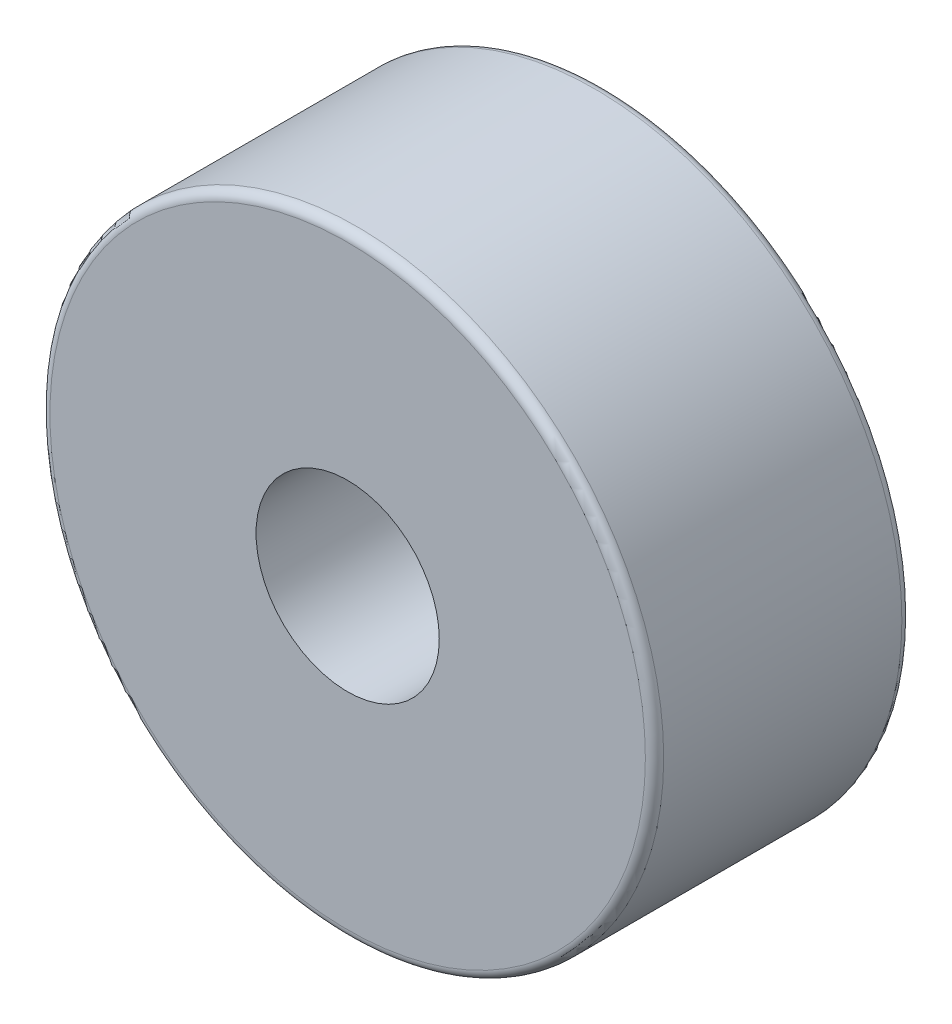
ISO-10303-21;
HEADER;
FILE_DESCRIPTION(('STEP AP214'),'2;1');
FILE_NAME('part.step','',(''),(''),'','','');
FILE_SCHEMA(('AUTOMOTIVE_DESIGN { 1 0 10303 214 1 1 1 1 }'));
ENDSEC;
DATA;
#1=APPLICATION_CONTEXT('core data for automotive mechanical design processes');
#2=APPLICATION_PROTOCOL_DEFINITION('international standard','automotive_design',2000,#1);
#3=PRODUCT_CONTEXT('',#1,'mechanical');
#4=PRODUCT('Part','Part','',(#3));
#5=PRODUCT_RELATED_PRODUCT_CATEGORY('part','',(#4));
#6=PRODUCT_DEFINITION_FORMATION('','',#4);
#7=PRODUCT_DEFINITION_CONTEXT('part definition',#1,'design');
#8=PRODUCT_DEFINITION('design','',#6,#7);
#9=PRODUCT_DEFINITION_SHAPE('','',#8);
#10=(LENGTH_UNIT() NAMED_UNIT(*) SI_UNIT(.MILLI.,.METRE.));
#11=(NAMED_UNIT(*) PLANE_ANGLE_UNIT() SI_UNIT($,.RADIAN.));
#12=(NAMED_UNIT(*) SI_UNIT($,.STERADIAN.) SOLID_ANGLE_UNIT());
#13=UNCERTAINTY_MEASURE_WITH_UNIT(LENGTH_MEASURE(1.E-05),#10,'distance_accuracy_value','');
#14=(GEOMETRIC_REPRESENTATION_CONTEXT(3) GLOBAL_UNCERTAINTY_ASSIGNED_CONTEXT((#13)) GLOBAL_UNIT_ASSIGNED_CONTEXT((#10,
#11,#12)) REPRESENTATION_CONTEXT('',''));
#15=CARTESIAN_POINT('',(0.,0.,0.));
#16=DIRECTION('',(0.,0.,1.));
#17=DIRECTION('',(1.,0.,0.));
#18=AXIS2_PLACEMENT_3D('',#15,#16,#17);
#19=CARTESIAN_POINT('',(0.,0.,28.));
#20=DIRECTION('',(0.,0.,1.));
#21=DIRECTION('',(1.,0.,0.));
#22=AXIS2_PLACEMENT_3D('',#19,#20,#21);
#23=PLANE('',#22);
#24=CARTESIAN_POINT('',(0.,0.,28.));
#25=DIRECTION('',(0.,0.,1.));
#26=DIRECTION('',(1.,0.,0.));
#27=AXIS2_PLACEMENT_3D('',#24,#25,#26);
#28=CIRCLE('',#27,32.5);
#29=CARTESIAN_POINT('',(32.5,0.,28.));
#30=VERTEX_POINT('',#29);
#31=EDGE_CURVE('E49',#30,#30,#28,.T.);
#32=ORIENTED_EDGE('',*,*,#31,.T.);
#33=EDGE_LOOP('',(#32));
#34=FACE_BOUND('',#33,.T.);
#35=CARTESIAN_POINT('',(0.,0.,28.));
#36=DIRECTION('',(0.,0.,1.));
#37=DIRECTION('',(1.,0.,0.));
#38=AXIS2_PLACEMENT_3D('',#35,#36,#37);
#39=CIRCLE('',#38,10.);
#40=CARTESIAN_POINT('',(10.,0.,28.));
#41=VERTEX_POINT('',#40);
#42=EDGE_CURVE('E54',#41,#41,#39,.T.);
#43=ORIENTED_EDGE('',*,*,#42,.F.);
#44=EDGE_LOOP('',(#43));
#45=FACE_BOUND('',#44,.T.);
#46=ADVANCED_FACE('F34',(#34,#45),#23,.T.);
#47=CARTESIAN_POINT('',(0.,0.,0.));
#48=DIRECTION('',(0.,0.,1.));
#49=DIRECTION('',(1.,0.,0.));
#50=AXIS2_PLACEMENT_3D('',#47,#48,#49);
#51=PLANE('',#50);
#52=CARTESIAN_POINT('',(0.,0.,0.));
#53=DIRECTION('',(0.,0.,1.));
#54=DIRECTION('',(1.,0.,0.));
#55=AXIS2_PLACEMENT_3D('',#52,#53,#54);
#56=CIRCLE('',#55,32.5);
#57=CARTESIAN_POINT('',(32.5,0.,0.));
#58=VERTEX_POINT('',#57);
#59=EDGE_CURVE('E10',#58,#58,#56,.F.);
#60=ORIENTED_EDGE('',*,*,#59,.T.);
#61=EDGE_LOOP('',(#60));
#62=FACE_BOUND('',#61,.T.);
#63=CARTESIAN_POINT('',(0.,0.,0.));
#64=DIRECTION('',(0.,0.,1.));
#65=DIRECTION('',(1.,0.,0.));
#66=AXIS2_PLACEMENT_3D('',#63,#64,#65);
#67=CIRCLE('',#66,10.);
#68=CARTESIAN_POINT('',(10.,0.,0.));
#69=VERTEX_POINT('',#68);
#70=EDGE_CURVE('E55',#69,#69,#67,.T.);
#71=ORIENTED_EDGE('',*,*,#70,.T.);
#72=EDGE_LOOP('',(#71));
#73=FACE_BOUND('',#72,.T.);
#74=ADVANCED_FACE('F65',(#62,#73),#51,.F.);
#75=CARTESIAN_POINT('',(0.,0.,28.));
#76=DIRECTION('',(0.,0.,-1.));
#77=DIRECTION('',(-1.,0.,0.));
#78=AXIS2_PLACEMENT_3D('',#75,#76,#77);
#79=CYLINDRICAL_SURFACE('',#78,33.5);
#80=CARTESIAN_POINT('',(0.,0.,27.));
#81=DIRECTION('',(0.,0.,1.));
#82=DIRECTION('',(1.,0.,0.));
#83=AXIS2_PLACEMENT_3D('',#80,#81,#82);
#84=CIRCLE('',#83,33.5);
#85=CARTESIAN_POINT('',(33.5,0.,27.));
#86=VERTEX_POINT('',#85);
#87=EDGE_CURVE('E41',#86,#86,#84,.F.);
#88=ORIENTED_EDGE('',*,*,#87,.T.);
#89=EDGE_LOOP('',(#88));
#90=FACE_BOUND('',#89,.T.);
#91=CARTESIAN_POINT('',(0.,0.,1.));
#92=DIRECTION('',(0.,0.,1.));
#93=DIRECTION('',(1.,0.,0.));
#94=AXIS2_PLACEMENT_3D('',#91,#92,#93);
#95=CIRCLE('',#94,33.5);
#96=CARTESIAN_POINT('',(33.5,0.,1.));
#97=VERTEX_POINT('',#96);
#98=EDGE_CURVE('E45',#97,#97,#95,.T.);
#99=ORIENTED_EDGE('',*,*,#98,.T.);
#100=EDGE_LOOP('',(#99));
#101=FACE_BOUND('',#100,.T.);
#102=ADVANCED_FACE('F71',(#90,#101),#79,.T.);
#103=CARTESIAN_POINT('',(0.,0.,28.));
#104=DIRECTION('',(0.,0.,-1.));
#105=DIRECTION('',(-1.,0.,0.));
#106=AXIS2_PLACEMENT_3D('',#103,#104,#105);
#107=CYLINDRICAL_SURFACE('',#106,10.);
#108=ORIENTED_EDGE('',*,*,#42,.T.);
#109=EDGE_LOOP('',(#108));
#110=FACE_BOUND('',#109,.T.);
#111=ORIENTED_EDGE('',*,*,#70,.F.);
#112=EDGE_LOOP('',(#111));
#113=FACE_BOUND('',#112,.T.);
#114=ADVANCED_FACE('F61',(#110,#113),#107,.F.);
#115=CARTESIAN_POINT('',(0.,0.,27.));
#116=DIRECTION('',(0.,0.,1.));
#117=DIRECTION('',(1.,0.,0.));
#118=AXIS2_PLACEMENT_3D('',#115,#116,#117);
#119=TOROIDAL_SURFACE('',#118,32.5,1.);
#120=ORIENTED_EDGE('',*,*,#87,.F.);
#121=EDGE_LOOP('',(#120));
#122=FACE_BOUND('',#121,.T.);
#123=ORIENTED_EDGE('',*,*,#31,.F.);
#124=EDGE_LOOP('',(#123));
#125=FACE_BOUND('',#124,.T.);
#126=ADVANCED_FACE('F76',(#122,#125),#119,.T.);
#127=CARTESIAN_POINT('',(0.,0.,1.));
#128=DIRECTION('',(0.,0.,1.));
#129=DIRECTION('',(1.,0.,0.));
#130=AXIS2_PLACEMENT_3D('',#127,#128,#129);
#131=TOROIDAL_SURFACE('',#130,32.5,1.);
#132=ORIENTED_EDGE('',*,*,#59,.F.);
#133=EDGE_LOOP('',(#132));
#134=FACE_BOUND('',#133,.T.);
#135=ORIENTED_EDGE('',*,*,#98,.F.);
#136=EDGE_LOOP('',(#135));
#137=FACE_BOUND('',#136,.T.);
#138=ADVANCED_FACE('F36',(#134,#137),#131,.T.);
#139=CLOSED_SHELL('',(#46,#74,#102,#114,#126,#138));
#140=MANIFOLD_SOLID_BREP('B2',#139);
#141=ADVANCED_BREP_SHAPE_REPRESENTATION('',(#18,#140),#14);
#142=SHAPE_DEFINITION_REPRESENTATION(#9,#141);
ENDSEC;
END-ISO-10303-21;
